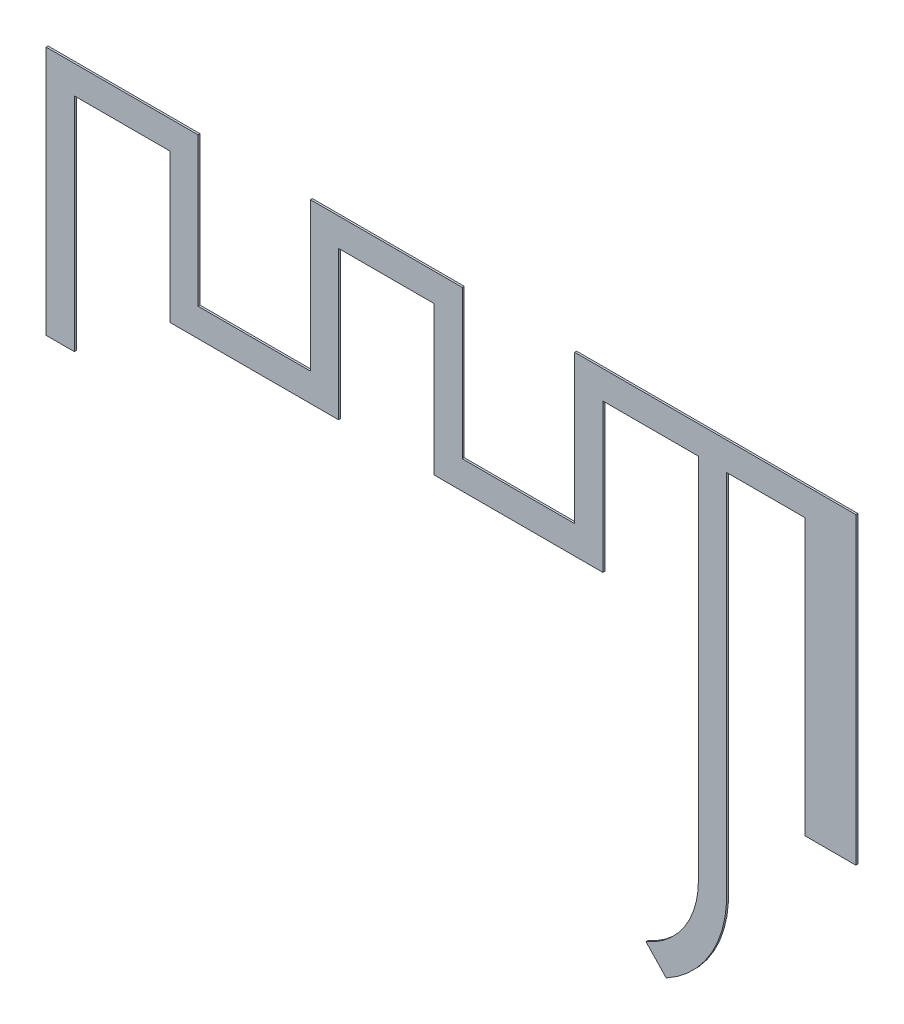
ISO-10303-21;
HEADER;
FILE_DESCRIPTION(('STEP AP214'),'2;1');
FILE_NAME('part.step','',(''),(''),'','','');
FILE_SCHEMA(('AUTOMOTIVE_DESIGN { 1 0 10303 214 1 1 1 1 }'));
ENDSEC;
DATA;
#1=APPLICATION_CONTEXT('core data for automotive mechanical design processes');
#2=APPLICATION_PROTOCOL_DEFINITION('international standard','automotive_design',2000,#1);
#3=PRODUCT_CONTEXT('',#1,'mechanical');
#4=PRODUCT('Part','Part','',(#3));
#5=PRODUCT_RELATED_PRODUCT_CATEGORY('part','',(#4));
#6=PRODUCT_DEFINITION_FORMATION('','',#4);
#7=PRODUCT_DEFINITION_CONTEXT('part definition',#1,'design');
#8=PRODUCT_DEFINITION('design','',#6,#7);
#9=PRODUCT_DEFINITION_SHAPE('','',#8);
#10=(LENGTH_UNIT() NAMED_UNIT(*) SI_UNIT(.MILLI.,.METRE.));
#11=(NAMED_UNIT(*) PLANE_ANGLE_UNIT() SI_UNIT($,.RADIAN.));
#12=(NAMED_UNIT(*) SI_UNIT($,.STERADIAN.) SOLID_ANGLE_UNIT());
#13=UNCERTAINTY_MEASURE_WITH_UNIT(LENGTH_MEASURE(1.E-05),#10,'distance_accuracy_value','');
#14=(GEOMETRIC_REPRESENTATION_CONTEXT(3) GLOBAL_UNCERTAINTY_ASSIGNED_CONTEXT((#13)) GLOBAL_UNIT_ASSIGNED_CONTEXT((#10,
#11,#12)) REPRESENTATION_CONTEXT('',''));
#15=CARTESIAN_POINT('',(0.,0.,0.));
#16=DIRECTION('',(0.,0.,1.));
#17=DIRECTION('',(1.,0.,0.));
#18=AXIS2_PLACEMENT_3D('',#15,#16,#17);
#19=CARTESIAN_POINT('',(177.15,-43.365,0.035));
#20=DIRECTION('',(-1.,0.,0.));
#21=DIRECTION('',(0.,0.,1.));
#22=AXIS2_PLACEMENT_3D('',#19,#20,#21);
#23=PLANE('',#22);
#24=DIRECTION('',(0.,1.,0.));
#25=VECTOR('',#24,1.);
#26=CARTESIAN_POINT('',(177.15,-43.365,0.));
#27=LINE('',#26,#25);
#28=CARTESIAN_POINT('',(177.15,-45.336779,0.));
#29=VERTEX_POINT('',#28);
#30=CARTESIAN_POINT('',(177.15,-38.715,0.));
#31=VERTEX_POINT('',#30);
#32=EDGE_CURVE('E157',#29,#31,#27,.T.);
#33=ORIENTED_EDGE('',*,*,#32,.T.);
#34=DIRECTION('',(0.,0.,-1.));
#35=VECTOR('',#34,1.);
#36=CARTESIAN_POINT('',(177.15,-38.715,0.035));
#37=LINE('',#36,#35);
#38=CARTESIAN_POINT('',(177.15,-38.715,0.035));
#39=VERTEX_POINT('',#38);
#40=EDGE_CURVE('E11',#39,#31,#37,.T.);
#41=ORIENTED_EDGE('',*,*,#40,.F.);
#42=DIRECTION('',(0.,1.,0.));
#43=VECTOR('',#42,1.);
#44=CARTESIAN_POINT('',(177.15,-43.365,0.035));
#45=LINE('',#44,#43);
#46=CARTESIAN_POINT('',(177.15,-45.336779,0.035));
#47=VERTEX_POINT('',#46);
#48=EDGE_CURVE('E163',#47,#39,#45,.T.);
#49=ORIENTED_EDGE('',*,*,#48,.F.);
#50=DIRECTION('',(0.,0.,-1.));
#51=VECTOR('',#50,1.);
#52=CARTESIAN_POINT('',(177.15,-45.336779,0.035));
#53=LINE('',#52,#51);
#54=EDGE_CURVE('E263',#47,#29,#53,.T.);
#55=ORIENTED_EDGE('',*,*,#54,.T.);
#56=EDGE_LOOP('',(#33,#41,#49,#55));
#57=FACE_BOUND('',#56,.T.);
#58=ADVANCED_FACE('F39',(#57),#23,.F.);
#59=CARTESIAN_POINT('',(177.15,-38.715,0.035));
#60=DIRECTION('',(0.,1.,0.));
#61=DIRECTION('',(0.,0.,1.));
#62=AXIS2_PLACEMENT_3D('',#59,#60,#61);
#63=PLANE('',#62);
#64=DIRECTION('',(1.,0.,0.));
#65=VECTOR('',#64,1.);
#66=CARTESIAN_POINT('',(177.15,-38.715,0.));
#67=LINE('',#66,#65);
#68=CARTESIAN_POINT('',(178.55,-38.715,0.));
#69=VERTEX_POINT('',#68);
#70=EDGE_CURVE('E268',#31,#69,#67,.T.);
#71=ORIENTED_EDGE('',*,*,#70,.T.);
#72=DIRECTION('',(0.,0.,-1.));
#73=VECTOR('',#72,1.);
#74=CARTESIAN_POINT('',(178.55,-38.715,0.035));
#75=LINE('',#74,#73);
#76=CARTESIAN_POINT('',(178.55,-38.715,0.035));
#77=VERTEX_POINT('',#76);
#78=EDGE_CURVE('E47',#77,#69,#75,.T.);
#79=ORIENTED_EDGE('',*,*,#78,.F.);
#80=DIRECTION('',(1.,0.,0.));
#81=VECTOR('',#80,1.);
#82=CARTESIAN_POINT('',(177.15,-38.715,0.035));
#83=LINE('',#82,#81);
#84=EDGE_CURVE('E482',#39,#77,#83,.T.);
#85=ORIENTED_EDGE('',*,*,#84,.F.);
#86=ORIENTED_EDGE('',*,*,#40,.T.);
#87=EDGE_LOOP('',(#71,#79,#85,#86));
#88=FACE_BOUND('',#87,.T.);
#89=ADVANCED_FACE('F485',(#88),#63,.F.);
#90=CARTESIAN_POINT('',(178.55,-38.715,0.035));
#91=DIRECTION('',(1.,0.,0.));
#92=DIRECTION('',(0.,0.,-1.));
#93=AXIS2_PLACEMENT_3D('',#90,#91,#92);
#94=PLANE('',#93);
#95=DIRECTION('',(0.,-1.,0.));
#96=VECTOR('',#95,1.);
#97=CARTESIAN_POINT('',(178.55,-38.715,0.));
#98=LINE('',#97,#96);
#99=CARTESIAN_POINT('',(178.55,-43.615,0.));
#100=VERTEX_POINT('',#99);
#101=EDGE_CURVE('E270',#69,#100,#98,.T.);
#102=ORIENTED_EDGE('',*,*,#101,.T.);
#103=DIRECTION('',(0.,0.,-1.));
#104=VECTOR('',#103,1.);
#105=CARTESIAN_POINT('',(178.55,-43.615,0.035));
#106=LINE('',#105,#104);
#107=CARTESIAN_POINT('',(178.55,-43.615,0.035));
#108=VERTEX_POINT('',#107);
#109=EDGE_CURVE('E398',#108,#100,#106,.T.);
#110=ORIENTED_EDGE('',*,*,#109,.F.);
#111=DIRECTION('',(0.,-1.,0.));
#112=VECTOR('',#111,1.);
#113=CARTESIAN_POINT('',(178.55,-38.715,0.035));
#114=LINE('',#113,#112);
#115=EDGE_CURVE('E407',#77,#108,#114,.T.);
#116=ORIENTED_EDGE('',*,*,#115,.F.);
#117=ORIENTED_EDGE('',*,*,#78,.T.);
#118=EDGE_LOOP('',(#102,#110,#116,#117));
#119=FACE_BOUND('',#118,.T.);
#120=ADVANCED_FACE('F405',(#119),#94,.F.);
#121=CARTESIAN_POINT('',(178.55,-43.615,0.035));
#122=DIRECTION('',(0.,1.,0.));
#123=DIRECTION('',(0.,0.,1.));
#124=AXIS2_PLACEMENT_3D('',#121,#122,#123);
#125=PLANE('',#124);
#126=DIRECTION('',(1.,0.,0.));
#127=VECTOR('',#126,1.);
#128=CARTESIAN_POINT('',(178.55,-43.615,0.));
#129=LINE('',#128,#127);
#130=CARTESIAN_POINT('',(179.45,-43.615,0.));
#131=VERTEX_POINT('',#130);
#132=EDGE_CURVE('E272',#100,#131,#129,.T.);
#133=ORIENTED_EDGE('',*,*,#132,.T.);
#134=DIRECTION('',(0.,0.,-1.));
#135=VECTOR('',#134,1.);
#136=CARTESIAN_POINT('',(179.45,-43.615,0.035));
#137=LINE('',#136,#135);
#138=CARTESIAN_POINT('',(179.45,-43.615,0.035));
#139=VERTEX_POINT('',#138);
#140=EDGE_CURVE('E395',#139,#131,#137,.T.);
#141=ORIENTED_EDGE('',*,*,#140,.F.);
#142=DIRECTION('',(1.,0.,0.));
#143=VECTOR('',#142,1.);
#144=CARTESIAN_POINT('',(178.55,-43.615,0.035));
#145=LINE('',#144,#143);
#146=EDGE_CURVE('E425',#108,#139,#145,.T.);
#147=ORIENTED_EDGE('',*,*,#146,.F.);
#148=ORIENTED_EDGE('',*,*,#109,.T.);
#149=EDGE_LOOP('',(#133,#141,#147,#148));
#150=FACE_BOUND('',#149,.T.);
#151=ADVANCED_FACE('F416',(#150),#125,.F.);
#152=CARTESIAN_POINT('',(179.45,-43.615,0.035));
#153=DIRECTION('',(-1.,0.,0.));
#154=DIRECTION('',(0.,0.,1.));
#155=AXIS2_PLACEMENT_3D('',#152,#153,#154);
#156=PLANE('',#155);
#157=DIRECTION('',(0.,1.,0.));
#158=VECTOR('',#157,1.);
#159=CARTESIAN_POINT('',(179.45,-43.615,0.));
#160=LINE('',#159,#158);
#161=CARTESIAN_POINT('',(179.45,-38.215,0.));
#162=VERTEX_POINT('',#161);
#163=EDGE_CURVE('E274',#131,#162,#160,.T.);
#164=ORIENTED_EDGE('',*,*,#163,.T.);
#165=DIRECTION('',(0.,0.,-1.));
#166=VECTOR('',#165,1.);
#167=CARTESIAN_POINT('',(179.45,-38.215,0.035));
#168=LINE('',#167,#166);
#169=CARTESIAN_POINT('',(179.45,-38.215,0.035));
#170=VERTEX_POINT('',#169);
#171=EDGE_CURVE('E392',#170,#162,#168,.T.);
#172=ORIENTED_EDGE('',*,*,#171,.F.);
#173=DIRECTION('',(0.,1.,0.));
#174=VECTOR('',#173,1.);
#175=CARTESIAN_POINT('',(179.45,-43.615,0.035));
#176=LINE('',#175,#174);
#177=EDGE_CURVE('E422',#139,#170,#176,.T.);
#178=ORIENTED_EDGE('',*,*,#177,.F.);
#179=ORIENTED_EDGE('',*,*,#140,.T.);
#180=EDGE_LOOP('',(#164,#172,#178,#179));
#181=FACE_BOUND('',#180,.T.);
#182=ADVANCED_FACE('F420',(#181),#156,.F.);
#183=CARTESIAN_POINT('',(179.45,-38.215,0.035));
#184=DIRECTION('',(0.,-1.,0.));
#185=DIRECTION('',(0.,0.,-1.));
#186=AXIS2_PLACEMENT_3D('',#183,#184,#185);
#187=PLANE('',#186);
#188=DIRECTION('',(-1.,0.,0.));
#189=VECTOR('',#188,1.);
#190=CARTESIAN_POINT('',(179.45,-38.215,0.));
#191=LINE('',#190,#189);
#192=CARTESIAN_POINT('',(174.45,-38.215,0.));
#193=VERTEX_POINT('',#192);
#194=EDGE_CURVE('E276',#162,#193,#191,.T.);
#195=ORIENTED_EDGE('',*,*,#194,.T.);
#196=DIRECTION('',(0.,0.,-1.));
#197=VECTOR('',#196,1.);
#198=CARTESIAN_POINT('',(174.45,-38.215,0.035));
#199=LINE('',#198,#197);
#200=CARTESIAN_POINT('',(174.45,-38.215,0.035));
#201=VERTEX_POINT('',#200);
#202=EDGE_CURVE('E389',#201,#193,#199,.T.);
#203=ORIENTED_EDGE('',*,*,#202,.F.);
#204=DIRECTION('',(-1.,0.,0.));
#205=VECTOR('',#204,1.);
#206=CARTESIAN_POINT('',(179.45,-38.215,0.035));
#207=LINE('',#206,#205);
#208=EDGE_CURVE('E424',#170,#201,#207,.T.);
#209=ORIENTED_EDGE('',*,*,#208,.F.);
#210=ORIENTED_EDGE('',*,*,#171,.T.);
#211=EDGE_LOOP('',(#195,#203,#209,#210));
#212=FACE_BOUND('',#211,.T.);
#213=ADVANCED_FACE('F497',(#212),#187,.F.);
#214=CARTESIAN_POINT('',(174.45,-38.215,0.035));
#215=DIRECTION('',(1.,0.,0.));
#216=DIRECTION('',(0.,0.,-1.));
#217=AXIS2_PLACEMENT_3D('',#214,#215,#216);
#218=PLANE('',#217);
#219=DIRECTION('',(0.,-1.,0.));
#220=VECTOR('',#219,1.);
#221=CARTESIAN_POINT('',(174.45,-38.215,0.));
#222=LINE('',#221,#220);
#223=CARTESIAN_POINT('',(174.45,-40.855,0.));
#224=VERTEX_POINT('',#223);
#225=EDGE_CURVE('E278',#193,#224,#222,.T.);
#226=ORIENTED_EDGE('',*,*,#225,.T.);
#227=DIRECTION('',(0.,0.,-1.));
#228=VECTOR('',#227,1.);
#229=CARTESIAN_POINT('',(174.45,-40.855,0.035));
#230=LINE('',#229,#228);
#231=CARTESIAN_POINT('',(174.45,-40.855,0.035));
#232=VERTEX_POINT('',#231);
#233=EDGE_CURVE('E386',#232,#224,#230,.T.);
#234=ORIENTED_EDGE('',*,*,#233,.F.);
#235=DIRECTION('',(0.,-1.,0.));
#236=VECTOR('',#235,1.);
#237=CARTESIAN_POINT('',(174.45,-38.215,0.035));
#238=LINE('',#237,#236);
#239=EDGE_CURVE('E427',#201,#232,#238,.T.);
#240=ORIENTED_EDGE('',*,*,#239,.F.);
#241=ORIENTED_EDGE('',*,*,#202,.T.);
#242=EDGE_LOOP('',(#226,#234,#240,#241));
#243=FACE_BOUND('',#242,.T.);
#244=ADVANCED_FACE('F500',(#243),#218,.F.);
#245=CARTESIAN_POINT('',(174.45,-40.855,0.035));
#246=DIRECTION('',(0.,-1.,0.));
#247=DIRECTION('',(0.,0.,-1.));
#248=AXIS2_PLACEMENT_3D('',#245,#246,#247);
#249=PLANE('',#248);
#250=DIRECTION('',(-1.,0.,0.));
#251=VECTOR('',#250,1.);
#252=CARTESIAN_POINT('',(174.45,-40.855,0.));
#253=LINE('',#252,#251);
#254=CARTESIAN_POINT('',(172.45,-40.855,0.));
#255=VERTEX_POINT('',#254);
#256=EDGE_CURVE('E280',#224,#255,#253,.T.);
#257=ORIENTED_EDGE('',*,*,#256,.T.);
#258=DIRECTION('',(0.,0.,-1.));
#259=VECTOR('',#258,1.);
#260=CARTESIAN_POINT('',(172.45,-40.855,0.035));
#261=LINE('',#260,#259);
#262=CARTESIAN_POINT('',(172.45,-40.855,0.035));
#263=VERTEX_POINT('',#262);
#264=EDGE_CURVE('E383',#263,#255,#261,.T.);
#265=ORIENTED_EDGE('',*,*,#264,.F.);
#266=DIRECTION('',(-1.,0.,0.));
#267=VECTOR('',#266,1.);
#268=CARTESIAN_POINT('',(174.45,-40.855,0.035));
#269=LINE('',#268,#267);
#270=EDGE_CURVE('E433',#232,#263,#269,.T.);
#271=ORIENTED_EDGE('',*,*,#270,.F.);
#272=ORIENTED_EDGE('',*,*,#233,.T.);
#273=EDGE_LOOP('',(#257,#265,#271,#272));
#274=FACE_BOUND('',#273,.T.);
#275=ADVANCED_FACE('F504',(#274),#249,.F.);
#276=CARTESIAN_POINT('',(172.45,-40.855,0.035));
#277=DIRECTION('',(-1.,0.,0.));
#278=DIRECTION('',(0.,0.,1.));
#279=AXIS2_PLACEMENT_3D('',#276,#277,#278);
#280=PLANE('',#279);
#281=DIRECTION('',(0.,1.,0.));
#282=VECTOR('',#281,1.);
#283=CARTESIAN_POINT('',(172.45,-40.855,0.));
#284=LINE('',#283,#282);
#285=CARTESIAN_POINT('',(172.45,-38.215,0.));
#286=VERTEX_POINT('',#285);
#287=EDGE_CURVE('E282',#255,#286,#284,.T.);
#288=ORIENTED_EDGE('',*,*,#287,.T.);
#289=DIRECTION('',(0.,0.,-1.));
#290=VECTOR('',#289,1.);
#291=CARTESIAN_POINT('',(172.45,-38.215,0.035));
#292=LINE('',#291,#290);
#293=CARTESIAN_POINT('',(172.45,-38.215,0.035));
#294=VERTEX_POINT('',#293);
#295=EDGE_CURVE('E380',#294,#286,#292,.T.);
#296=ORIENTED_EDGE('',*,*,#295,.F.);
#297=DIRECTION('',(0.,1.,0.));
#298=VECTOR('',#297,1.);
#299=CARTESIAN_POINT('',(172.45,-40.855,0.035));
#300=LINE('',#299,#298);
#301=EDGE_CURVE('E435',#263,#294,#300,.T.);
#302=ORIENTED_EDGE('',*,*,#301,.F.);
#303=ORIENTED_EDGE('',*,*,#264,.T.);
#304=EDGE_LOOP('',(#288,#296,#302,#303));
#305=FACE_BOUND('',#304,.T.);
#306=ADVANCED_FACE('F508',(#305),#280,.F.);
#307=CARTESIAN_POINT('',(172.45,-38.215,0.035));
#308=DIRECTION('',(0.,-1.,0.));
#309=DIRECTION('',(0.,0.,-1.));
#310=AXIS2_PLACEMENT_3D('',#307,#308,#309);
#311=PLANE('',#310);
#312=DIRECTION('',(-1.,0.,0.));
#313=VECTOR('',#312,1.);
#314=CARTESIAN_POINT('',(172.45,-38.215,0.));
#315=LINE('',#314,#313);
#316=CARTESIAN_POINT('',(169.75,-38.215,0.));
#317=VERTEX_POINT('',#316);
#318=EDGE_CURVE('E284',#286,#317,#315,.T.);
#319=ORIENTED_EDGE('',*,*,#318,.T.);
#320=DIRECTION('',(0.,0.,-1.));
#321=VECTOR('',#320,1.);
#322=CARTESIAN_POINT('',(169.75,-38.215,0.035));
#323=LINE('',#322,#321);
#324=CARTESIAN_POINT('',(169.75,-38.215,0.035));
#325=VERTEX_POINT('',#324);
#326=EDGE_CURVE('E377',#325,#317,#323,.T.);
#327=ORIENTED_EDGE('',*,*,#326,.F.);
#328=DIRECTION('',(-1.,0.,0.));
#329=VECTOR('',#328,1.);
#330=CARTESIAN_POINT('',(172.45,-38.215,0.035));
#331=LINE('',#330,#329);
#332=EDGE_CURVE('E437',#294,#325,#331,.T.);
#333=ORIENTED_EDGE('',*,*,#332,.F.);
#334=ORIENTED_EDGE('',*,*,#295,.T.);
#335=EDGE_LOOP('',(#319,#327,#333,#334));
#336=FACE_BOUND('',#335,.T.);
#337=ADVANCED_FACE('F512',(#336),#311,.F.);
#338=CARTESIAN_POINT('',(169.75,-38.215,0.035));
#339=DIRECTION('',(1.,0.,0.));
#340=DIRECTION('',(0.,0.,-1.));
#341=AXIS2_PLACEMENT_3D('',#338,#339,#340);
#342=PLANE('',#341);
#343=DIRECTION('',(0.,-1.,0.));
#344=VECTOR('',#343,1.);
#345=CARTESIAN_POINT('',(169.75,-38.215,0.));
#346=LINE('',#345,#344);
#347=CARTESIAN_POINT('',(169.75,-40.855,0.));
#348=VERTEX_POINT('',#347);
#349=EDGE_CURVE('E286',#317,#348,#346,.T.);
#350=ORIENTED_EDGE('',*,*,#349,.T.);
#351=DIRECTION('',(0.,0.,-1.));
#352=VECTOR('',#351,1.);
#353=CARTESIAN_POINT('',(169.75,-40.855,0.035));
#354=LINE('',#353,#352);
#355=CARTESIAN_POINT('',(169.75,-40.855,0.035));
#356=VERTEX_POINT('',#355);
#357=EDGE_CURVE('E374',#356,#348,#354,.T.);
#358=ORIENTED_EDGE('',*,*,#357,.F.);
#359=DIRECTION('',(0.,-1.,0.));
#360=VECTOR('',#359,1.);
#361=CARTESIAN_POINT('',(169.75,-38.215,0.035));
#362=LINE('',#361,#360);
#363=EDGE_CURVE('E439',#325,#356,#362,.T.);
#364=ORIENTED_EDGE('',*,*,#363,.F.);
#365=ORIENTED_EDGE('',*,*,#326,.T.);
#366=EDGE_LOOP('',(#350,#358,#364,#365));
#367=FACE_BOUND('',#366,.T.);
#368=ADVANCED_FACE('F516',(#367),#342,.F.);
#369=CARTESIAN_POINT('',(169.75,-40.855,0.035));
#370=DIRECTION('',(0.,-1.,0.));
#371=DIRECTION('',(0.,0.,-1.));
#372=AXIS2_PLACEMENT_3D('',#369,#370,#371);
#373=PLANE('',#372);
#374=DIRECTION('',(-1.,0.,0.));
#375=VECTOR('',#374,1.);
#376=CARTESIAN_POINT('',(169.75,-40.855,0.));
#377=LINE('',#376,#375);
#378=CARTESIAN_POINT('',(167.75,-40.855,0.));
#379=VERTEX_POINT('',#378);
#380=EDGE_CURVE('E288',#348,#379,#377,.T.);
#381=ORIENTED_EDGE('',*,*,#380,.T.);
#382=DIRECTION('',(0.,0.,-1.));
#383=VECTOR('',#382,1.);
#384=CARTESIAN_POINT('',(167.75,-40.855,0.035));
#385=LINE('',#384,#383);
#386=CARTESIAN_POINT('',(167.75,-40.855,0.035));
#387=VERTEX_POINT('',#386);
#388=EDGE_CURVE('E371',#387,#379,#385,.T.);
#389=ORIENTED_EDGE('',*,*,#388,.F.);
#390=DIRECTION('',(-1.,0.,0.));
#391=VECTOR('',#390,1.);
#392=CARTESIAN_POINT('',(169.75,-40.855,0.035));
#393=LINE('',#392,#391);
#394=EDGE_CURVE('E441',#356,#387,#393,.T.);
#395=ORIENTED_EDGE('',*,*,#394,.F.);
#396=ORIENTED_EDGE('',*,*,#357,.T.);
#397=EDGE_LOOP('',(#381,#389,#395,#396));
#398=FACE_BOUND('',#397,.T.);
#399=ADVANCED_FACE('F520',(#398),#373,.F.);
#400=CARTESIAN_POINT('',(167.75,-40.855,0.035));
#401=DIRECTION('',(-1.,0.,0.));
#402=DIRECTION('',(0.,0.,1.));
#403=AXIS2_PLACEMENT_3D('',#400,#401,#402);
#404=PLANE('',#403);
#405=DIRECTION('',(0.,1.,0.));
#406=VECTOR('',#405,1.);
#407=CARTESIAN_POINT('',(167.75,-40.855,0.));
#408=LINE('',#407,#406);
#409=CARTESIAN_POINT('',(167.75,-38.215,0.));
#410=VERTEX_POINT('',#409);
#411=EDGE_CURVE('E290',#379,#410,#408,.T.);
#412=ORIENTED_EDGE('',*,*,#411,.T.);
#413=DIRECTION('',(0.,0.,-1.));
#414=VECTOR('',#413,1.);
#415=CARTESIAN_POINT('',(167.75,-38.215,0.035));
#416=LINE('',#415,#414);
#417=CARTESIAN_POINT('',(167.75,-38.215,0.035));
#418=VERTEX_POINT('',#417);
#419=EDGE_CURVE('E368',#418,#410,#416,.T.);
#420=ORIENTED_EDGE('',*,*,#419,.F.);
#421=DIRECTION('',(0.,1.,0.));
#422=VECTOR('',#421,1.);
#423=CARTESIAN_POINT('',(167.75,-40.855,0.035));
#424=LINE('',#423,#422);
#425=EDGE_CURVE('E443',#387,#418,#424,.T.);
#426=ORIENTED_EDGE('',*,*,#425,.F.);
#427=ORIENTED_EDGE('',*,*,#388,.T.);
#428=EDGE_LOOP('',(#412,#420,#426,#427));
#429=FACE_BOUND('',#428,.T.);
#430=ADVANCED_FACE('F524',(#429),#404,.F.);
#431=CARTESIAN_POINT('',(167.75,-38.215,0.035));
#432=DIRECTION('',(0.,-1.,0.));
#433=DIRECTION('',(0.,0.,-1.));
#434=AXIS2_PLACEMENT_3D('',#431,#432,#433);
#435=PLANE('',#434);
#436=DIRECTION('',(-1.,0.,0.));
#437=VECTOR('',#436,1.);
#438=CARTESIAN_POINT('',(167.75,-38.215,0.));
#439=LINE('',#438,#437);
#440=CARTESIAN_POINT('',(165.05,-38.215,0.));
#441=VERTEX_POINT('',#440);
#442=EDGE_CURVE('E292',#410,#441,#439,.T.);
#443=ORIENTED_EDGE('',*,*,#442,.T.);
#444=DIRECTION('',(0.,0.,-1.));
#445=VECTOR('',#444,1.);
#446=CARTESIAN_POINT('',(165.05,-38.215,0.035));
#447=LINE('',#446,#445);
#448=CARTESIAN_POINT('',(165.05,-38.215,0.035));
#449=VERTEX_POINT('',#448);
#450=EDGE_CURVE('E365',#449,#441,#447,.T.);
#451=ORIENTED_EDGE('',*,*,#450,.F.);
#452=DIRECTION('',(-1.,0.,0.));
#453=VECTOR('',#452,1.);
#454=CARTESIAN_POINT('',(167.75,-38.215,0.035));
#455=LINE('',#454,#453);
#456=EDGE_CURVE('E445',#418,#449,#455,.T.);
#457=ORIENTED_EDGE('',*,*,#456,.F.);
#458=ORIENTED_EDGE('',*,*,#419,.T.);
#459=EDGE_LOOP('',(#443,#451,#457,#458));
#460=FACE_BOUND('',#459,.T.);
#461=ADVANCED_FACE('F528',(#460),#435,.F.);
#462=CARTESIAN_POINT('',(165.05,-38.215,0.035));
#463=DIRECTION('',(1.,0.,0.));
#464=DIRECTION('',(0.,0.,-1.));
#465=AXIS2_PLACEMENT_3D('',#462,#463,#464);
#466=PLANE('',#465);
#467=DIRECTION('',(0.,-1.,0.));
#468=VECTOR('',#467,1.);
#469=CARTESIAN_POINT('',(165.05,-38.215,0.));
#470=LINE('',#469,#468);
#471=CARTESIAN_POINT('',(165.05,-42.655,0.));
#472=VERTEX_POINT('',#471);
#473=EDGE_CURVE('E294',#441,#472,#470,.T.);
#474=ORIENTED_EDGE('',*,*,#473,.T.);
#475=DIRECTION('',(0.,0.,-1.));
#476=VECTOR('',#475,1.);
#477=CARTESIAN_POINT('',(165.05,-42.655,0.035));
#478=LINE('',#477,#476);
#479=CARTESIAN_POINT('',(165.05,-42.655,0.035));
#480=VERTEX_POINT('',#479);
#481=EDGE_CURVE('E362',#480,#472,#478,.T.);
#482=ORIENTED_EDGE('',*,*,#481,.F.);
#483=DIRECTION('',(0.,-1.,0.));
#484=VECTOR('',#483,1.);
#485=CARTESIAN_POINT('',(165.05,-38.215,0.035));
#486=LINE('',#485,#484);
#487=EDGE_CURVE('E447',#449,#480,#486,.T.);
#488=ORIENTED_EDGE('',*,*,#487,.F.);
#489=ORIENTED_EDGE('',*,*,#450,.T.);
#490=EDGE_LOOP('',(#474,#482,#488,#489));
#491=FACE_BOUND('',#490,.T.);
#492=ADVANCED_FACE('F532',(#491),#466,.F.);
#493=CARTESIAN_POINT('',(165.05,-42.655,0.035));
#494=DIRECTION('',(0.,1.,0.));
#495=DIRECTION('',(0.,0.,1.));
#496=AXIS2_PLACEMENT_3D('',#493,#494,#495);
#497=PLANE('',#496);
#498=DIRECTION('',(1.,0.,0.));
#499=VECTOR('',#498,1.);
#500=CARTESIAN_POINT('',(165.05,-42.655,0.));
#501=LINE('',#500,#499);
#502=CARTESIAN_POINT('',(165.55,-42.655,0.));
#503=VERTEX_POINT('',#502);
#504=EDGE_CURVE('E296',#472,#503,#501,.T.);
#505=ORIENTED_EDGE('',*,*,#504,.T.);
#506=DIRECTION('',(0.,0.,-1.));
#507=VECTOR('',#506,1.);
#508=CARTESIAN_POINT('',(165.55,-42.655,0.035));
#509=LINE('',#508,#507);
#510=CARTESIAN_POINT('',(165.55,-42.655,0.035));
#511=VERTEX_POINT('',#510);
#512=EDGE_CURVE('E359',#511,#503,#509,.T.);
#513=ORIENTED_EDGE('',*,*,#512,.F.);
#514=DIRECTION('',(1.,0.,0.));
#515=VECTOR('',#514,1.);
#516=CARTESIAN_POINT('',(165.05,-42.655,0.035));
#517=LINE('',#516,#515);
#518=EDGE_CURVE('E449',#480,#511,#517,.T.);
#519=ORIENTED_EDGE('',*,*,#518,.F.);
#520=ORIENTED_EDGE('',*,*,#481,.T.);
#521=EDGE_LOOP('',(#505,#513,#519,#520));
#522=FACE_BOUND('',#521,.T.);
#523=ADVANCED_FACE('F536',(#522),#497,.F.);
#524=CARTESIAN_POINT('',(165.55,-42.655,0.035));
#525=DIRECTION('',(-1.,0.,0.));
#526=DIRECTION('',(0.,0.,1.));
#527=AXIS2_PLACEMENT_3D('',#524,#525,#526);
#528=PLANE('',#527);
#529=DIRECTION('',(0.,1.,0.));
#530=VECTOR('',#529,1.);
#531=CARTESIAN_POINT('',(165.55,-42.655,0.));
#532=LINE('',#531,#530);
#533=CARTESIAN_POINT('',(165.55,-38.715,0.));
#534=VERTEX_POINT('',#533);
#535=EDGE_CURVE('E298',#503,#534,#532,.T.);
#536=ORIENTED_EDGE('',*,*,#535,.T.);
#537=DIRECTION('',(0.,0.,-1.));
#538=VECTOR('',#537,1.);
#539=CARTESIAN_POINT('',(165.55,-38.715,0.035));
#540=LINE('',#539,#538);
#541=CARTESIAN_POINT('',(165.55,-38.715,0.035));
#542=VERTEX_POINT('',#541);
#543=EDGE_CURVE('E356',#542,#534,#540,.T.);
#544=ORIENTED_EDGE('',*,*,#543,.F.);
#545=DIRECTION('',(0.,1.,0.));
#546=VECTOR('',#545,1.);
#547=CARTESIAN_POINT('',(165.55,-42.655,0.035));
#548=LINE('',#547,#546);
#549=EDGE_CURVE('E451',#511,#542,#548,.T.);
#550=ORIENTED_EDGE('',*,*,#549,.F.);
#551=ORIENTED_EDGE('',*,*,#512,.T.);
#552=EDGE_LOOP('',(#536,#544,#550,#551));
#553=FACE_BOUND('',#552,.T.);
#554=ADVANCED_FACE('F540',(#553),#528,.F.);
#555=CARTESIAN_POINT('',(165.55,-38.715,0.035));
#556=DIRECTION('',(0.,1.,0.));
#557=DIRECTION('',(0.,0.,1.));
#558=AXIS2_PLACEMENT_3D('',#555,#556,#557);
#559=PLANE('',#558);
#560=DIRECTION('',(1.,0.,0.));
#561=VECTOR('',#560,1.);
#562=CARTESIAN_POINT('',(165.55,-38.715,0.));
#563=LINE('',#562,#561);
#564=CARTESIAN_POINT('',(167.25,-38.715,0.));
#565=VERTEX_POINT('',#564);
#566=EDGE_CURVE('E300',#534,#565,#563,.T.);
#567=ORIENTED_EDGE('',*,*,#566,.T.);
#568=DIRECTION('',(0.,0.,-1.));
#569=VECTOR('',#568,1.);
#570=CARTESIAN_POINT('',(167.25,-38.715,0.035));
#571=LINE('',#570,#569);
#572=CARTESIAN_POINT('',(167.25,-38.715,0.035));
#573=VERTEX_POINT('',#572);
#574=EDGE_CURVE('E353',#573,#565,#571,.T.);
#575=ORIENTED_EDGE('',*,*,#574,.F.);
#576=DIRECTION('',(1.,0.,0.));
#577=VECTOR('',#576,1.);
#578=CARTESIAN_POINT('',(165.55,-38.715,0.035));
#579=LINE('',#578,#577);
#580=EDGE_CURVE('E453',#542,#573,#579,.T.);
#581=ORIENTED_EDGE('',*,*,#580,.F.);
#582=ORIENTED_EDGE('',*,*,#543,.T.);
#583=EDGE_LOOP('',(#567,#575,#581,#582));
#584=FACE_BOUND('',#583,.T.);
#585=ADVANCED_FACE('F544',(#584),#559,.F.);
#586=CARTESIAN_POINT('',(167.25,-38.715,0.035));
#587=DIRECTION('',(1.,0.,0.));
#588=DIRECTION('',(0.,0.,-1.));
#589=AXIS2_PLACEMENT_3D('',#586,#587,#588);
#590=PLANE('',#589);
#591=DIRECTION('',(0.,-1.,0.));
#592=VECTOR('',#591,1.);
#593=CARTESIAN_POINT('',(167.25,-38.715,0.));
#594=LINE('',#593,#592);
#595=CARTESIAN_POINT('',(167.25,-41.355,0.));
#596=VERTEX_POINT('',#595);
#597=EDGE_CURVE('E302',#565,#596,#594,.T.);
#598=ORIENTED_EDGE('',*,*,#597,.T.);
#599=DIRECTION('',(0.,0.,-1.));
#600=VECTOR('',#599,1.);
#601=CARTESIAN_POINT('',(167.25,-41.355,0.035));
#602=LINE('',#601,#600);
#603=CARTESIAN_POINT('',(167.25,-41.355,0.035));
#604=VERTEX_POINT('',#603);
#605=EDGE_CURVE('E350',#604,#596,#602,.T.);
#606=ORIENTED_EDGE('',*,*,#605,.F.);
#607=DIRECTION('',(0.,-1.,0.));
#608=VECTOR('',#607,1.);
#609=CARTESIAN_POINT('',(167.25,-38.715,0.035));
#610=LINE('',#609,#608);
#611=EDGE_CURVE('E455',#573,#604,#610,.T.);
#612=ORIENTED_EDGE('',*,*,#611,.F.);
#613=ORIENTED_EDGE('',*,*,#574,.T.);
#614=EDGE_LOOP('',(#598,#606,#612,#613));
#615=FACE_BOUND('',#614,.T.);
#616=ADVANCED_FACE('F548',(#615),#590,.F.);
#617=CARTESIAN_POINT('',(167.25,-41.355,0.035));
#618=DIRECTION('',(0.,1.,0.));
#619=DIRECTION('',(0.,0.,1.));
#620=AXIS2_PLACEMENT_3D('',#617,#618,#619);
#621=PLANE('',#620);
#622=DIRECTION('',(1.,0.,0.));
#623=VECTOR('',#622,1.);
#624=CARTESIAN_POINT('',(167.25,-41.355,0.));
#625=LINE('',#624,#623);
#626=CARTESIAN_POINT('',(170.25,-41.355,0.));
#627=VERTEX_POINT('',#626);
#628=EDGE_CURVE('E304',#596,#627,#625,.T.);
#629=ORIENTED_EDGE('',*,*,#628,.T.);
#630=DIRECTION('',(0.,0.,-1.));
#631=VECTOR('',#630,1.);
#632=CARTESIAN_POINT('',(170.25,-41.355,0.035));
#633=LINE('',#632,#631);
#634=CARTESIAN_POINT('',(170.25,-41.355,0.035));
#635=VERTEX_POINT('',#634);
#636=EDGE_CURVE('E347',#635,#627,#633,.T.);
#637=ORIENTED_EDGE('',*,*,#636,.F.);
#638=DIRECTION('',(1.,0.,0.));
#639=VECTOR('',#638,1.);
#640=CARTESIAN_POINT('',(167.25,-41.355,0.035));
#641=LINE('',#640,#639);
#642=EDGE_CURVE('E457',#604,#635,#641,.T.);
#643=ORIENTED_EDGE('',*,*,#642,.F.);
#644=ORIENTED_EDGE('',*,*,#605,.T.);
#645=EDGE_LOOP('',(#629,#637,#643,#644));
#646=FACE_BOUND('',#645,.T.);
#647=ADVANCED_FACE('F552',(#646),#621,.F.);
#648=CARTESIAN_POINT('',(170.25,-41.355,0.035));
#649=DIRECTION('',(-1.,0.,0.));
#650=DIRECTION('',(0.,0.,1.));
#651=AXIS2_PLACEMENT_3D('',#648,#649,#650);
#652=PLANE('',#651);
#653=DIRECTION('',(0.,1.,0.));
#654=VECTOR('',#653,1.);
#655=CARTESIAN_POINT('',(170.25,-41.355,0.));
#656=LINE('',#655,#654);
#657=CARTESIAN_POINT('',(170.25,-38.715,0.));
#658=VERTEX_POINT('',#657);
#659=EDGE_CURVE('E306',#627,#658,#656,.T.);
#660=ORIENTED_EDGE('',*,*,#659,.T.);
#661=DIRECTION('',(0.,0.,-1.));
#662=VECTOR('',#661,1.);
#663=CARTESIAN_POINT('',(170.25,-38.715,0.035));
#664=LINE('',#663,#662);
#665=CARTESIAN_POINT('',(170.25,-38.715,0.035));
#666=VERTEX_POINT('',#665);
#667=EDGE_CURVE('E344',#666,#658,#664,.T.);
#668=ORIENTED_EDGE('',*,*,#667,.F.);
#669=DIRECTION('',(0.,1.,0.));
#670=VECTOR('',#669,1.);
#671=CARTESIAN_POINT('',(170.25,-41.355,0.035));
#672=LINE('',#671,#670);
#673=EDGE_CURVE('E459',#635,#666,#672,.T.);
#674=ORIENTED_EDGE('',*,*,#673,.F.);
#675=ORIENTED_EDGE('',*,*,#636,.T.);
#676=EDGE_LOOP('',(#660,#668,#674,#675));
#677=FACE_BOUND('',#676,.T.);
#678=ADVANCED_FACE('F556',(#677),#652,.F.);
#679=CARTESIAN_POINT('',(170.25,-38.715,0.035));
#680=DIRECTION('',(0.,1.,0.));
#681=DIRECTION('',(0.,0.,1.));
#682=AXIS2_PLACEMENT_3D('',#679,#680,#681);
#683=PLANE('',#682);
#684=DIRECTION('',(1.,0.,0.));
#685=VECTOR('',#684,1.);
#686=CARTESIAN_POINT('',(170.25,-38.715,0.));
#687=LINE('',#686,#685);
#688=CARTESIAN_POINT('',(171.95,-38.715,0.));
#689=VERTEX_POINT('',#688);
#690=EDGE_CURVE('E308',#658,#689,#687,.T.);
#691=ORIENTED_EDGE('',*,*,#690,.T.);
#692=DIRECTION('',(0.,0.,-1.));
#693=VECTOR('',#692,1.);
#694=CARTESIAN_POINT('',(171.95,-38.715,0.035));
#695=LINE('',#694,#693);
#696=CARTESIAN_POINT('',(171.95,-38.715,0.035));
#697=VERTEX_POINT('',#696);
#698=EDGE_CURVE('E341',#697,#689,#695,.T.);
#699=ORIENTED_EDGE('',*,*,#698,.F.);
#700=DIRECTION('',(1.,0.,0.));
#701=VECTOR('',#700,1.);
#702=CARTESIAN_POINT('',(170.25,-38.715,0.035));
#703=LINE('',#702,#701);
#704=EDGE_CURVE('E461',#666,#697,#703,.T.);
#705=ORIENTED_EDGE('',*,*,#704,.F.);
#706=ORIENTED_EDGE('',*,*,#667,.T.);
#707=EDGE_LOOP('',(#691,#699,#705,#706));
#708=FACE_BOUND('',#707,.T.);
#709=ADVANCED_FACE('F560',(#708),#683,.F.);
#710=CARTESIAN_POINT('',(171.95,-38.715,0.035));
#711=DIRECTION('',(1.,0.,0.));
#712=DIRECTION('',(0.,0.,-1.));
#713=AXIS2_PLACEMENT_3D('',#710,#711,#712);
#714=PLANE('',#713);
#715=DIRECTION('',(0.,-1.,0.));
#716=VECTOR('',#715,1.);
#717=CARTESIAN_POINT('',(171.95,-38.715,0.));
#718=LINE('',#717,#716);
#719=CARTESIAN_POINT('',(171.95,-41.355,0.));
#720=VERTEX_POINT('',#719);
#721=EDGE_CURVE('E310',#689,#720,#718,.T.);
#722=ORIENTED_EDGE('',*,*,#721,.T.);
#723=DIRECTION('',(0.,0.,-1.));
#724=VECTOR('',#723,1.);
#725=CARTESIAN_POINT('',(171.95,-41.355,0.035));
#726=LINE('',#725,#724);
#727=CARTESIAN_POINT('',(171.95,-41.355,0.035));
#728=VERTEX_POINT('',#727);
#729=EDGE_CURVE('E338',#728,#720,#726,.T.);
#730=ORIENTED_EDGE('',*,*,#729,.F.);
#731=DIRECTION('',(0.,-1.,0.));
#732=VECTOR('',#731,1.);
#733=CARTESIAN_POINT('',(171.95,-38.715,0.035));
#734=LINE('',#733,#732);
#735=EDGE_CURVE('E463',#697,#728,#734,.T.);
#736=ORIENTED_EDGE('',*,*,#735,.F.);
#737=ORIENTED_EDGE('',*,*,#698,.T.);
#738=EDGE_LOOP('',(#722,#730,#736,#737));
#739=FACE_BOUND('',#738,.T.);
#740=ADVANCED_FACE('F564',(#739),#714,.F.);
#741=CARTESIAN_POINT('',(171.95,-41.355,0.035));
#742=DIRECTION('',(0.,1.,0.));
#743=DIRECTION('',(0.,0.,1.));
#744=AXIS2_PLACEMENT_3D('',#741,#742,#743);
#745=PLANE('',#744);
#746=DIRECTION('',(1.,0.,0.));
#747=VECTOR('',#746,1.);
#748=CARTESIAN_POINT('',(171.95,-41.355,0.));
#749=LINE('',#748,#747);
#750=CARTESIAN_POINT('',(174.95,-41.355,0.));
#751=VERTEX_POINT('',#750);
#752=EDGE_CURVE('E312',#720,#751,#749,.T.);
#753=ORIENTED_EDGE('',*,*,#752,.T.);
#754=DIRECTION('',(0.,0.,-1.));
#755=VECTOR('',#754,1.);
#756=CARTESIAN_POINT('',(174.95,-41.355,0.035));
#757=LINE('',#756,#755);
#758=CARTESIAN_POINT('',(174.95,-41.355,0.035));
#759=VERTEX_POINT('',#758);
#760=EDGE_CURVE('E335',#759,#751,#757,.T.);
#761=ORIENTED_EDGE('',*,*,#760,.F.);
#762=DIRECTION('',(1.,0.,0.));
#763=VECTOR('',#762,1.);
#764=CARTESIAN_POINT('',(171.95,-41.355,0.035));
#765=LINE('',#764,#763);
#766=EDGE_CURVE('E465',#728,#759,#765,.T.);
#767=ORIENTED_EDGE('',*,*,#766,.F.);
#768=ORIENTED_EDGE('',*,*,#729,.T.);
#769=EDGE_LOOP('',(#753,#761,#767,#768));
#770=FACE_BOUND('',#769,.T.);
#771=ADVANCED_FACE('F568',(#770),#745,.F.);
#772=CARTESIAN_POINT('',(174.95,-41.355,0.035));
#773=DIRECTION('',(-1.,0.,0.));
#774=DIRECTION('',(0.,0.,1.));
#775=AXIS2_PLACEMENT_3D('',#772,#773,#774);
#776=PLANE('',#775);
#777=DIRECTION('',(0.,1.,0.));
#778=VECTOR('',#777,1.);
#779=CARTESIAN_POINT('',(174.95,-41.355,0.));
#780=LINE('',#779,#778);
#781=CARTESIAN_POINT('',(174.95,-38.715,0.));
#782=VERTEX_POINT('',#781);
#783=EDGE_CURVE('E314',#751,#782,#780,.T.);
#784=ORIENTED_EDGE('',*,*,#783,.T.);
#785=DIRECTION('',(0.,0.,-1.));
#786=VECTOR('',#785,1.);
#787=CARTESIAN_POINT('',(174.95,-38.715,0.035));
#788=LINE('',#787,#786);
#789=CARTESIAN_POINT('',(174.95,-38.715,0.035));
#790=VERTEX_POINT('',#789);
#791=EDGE_CURVE('E332',#790,#782,#788,.T.);
#792=ORIENTED_EDGE('',*,*,#791,.F.);
#793=DIRECTION('',(0.,1.,0.));
#794=VECTOR('',#793,1.);
#795=CARTESIAN_POINT('',(174.95,-41.355,0.035));
#796=LINE('',#795,#794);
#797=EDGE_CURVE('E467',#759,#790,#796,.T.);
#798=ORIENTED_EDGE('',*,*,#797,.F.);
#799=ORIENTED_EDGE('',*,*,#760,.T.);
#800=EDGE_LOOP('',(#784,#792,#798,#799));
#801=FACE_BOUND('',#800,.T.);
#802=ADVANCED_FACE('F572',(#801),#776,.F.);
#803=CARTESIAN_POINT('',(174.95,-38.715,0.035));
#804=DIRECTION('',(0.,1.,0.));
#805=DIRECTION('',(0.,0.,1.));
#806=AXIS2_PLACEMENT_3D('',#803,#804,#805);
#807=PLANE('',#806);
#808=DIRECTION('',(1.,0.,0.));
#809=VECTOR('',#808,1.);
#810=CARTESIAN_POINT('',(174.95,-38.715,0.));
#811=LINE('',#810,#809);
#812=CARTESIAN_POINT('',(176.65,-38.715,0.));
#813=VERTEX_POINT('',#812);
#814=EDGE_CURVE('E316',#782,#813,#811,.T.);
#815=ORIENTED_EDGE('',*,*,#814,.T.);
#816=DIRECTION('',(0.,0.,-1.));
#817=VECTOR('',#816,1.);
#818=CARTESIAN_POINT('',(176.65,-38.715,0.035));
#819=LINE('',#818,#817);
#820=CARTESIAN_POINT('',(176.65,-38.715,0.035));
#821=VERTEX_POINT('',#820);
#822=EDGE_CURVE('E329',#821,#813,#819,.T.);
#823=ORIENTED_EDGE('',*,*,#822,.F.);
#824=DIRECTION('',(1.,0.,0.));
#825=VECTOR('',#824,1.);
#826=CARTESIAN_POINT('',(174.95,-38.715,0.035));
#827=LINE('',#826,#825);
#828=EDGE_CURVE('E469',#790,#821,#827,.T.);
#829=ORIENTED_EDGE('',*,*,#828,.F.);
#830=ORIENTED_EDGE('',*,*,#791,.T.);
#831=EDGE_LOOP('',(#815,#823,#829,#830));
#832=FACE_BOUND('',#831,.T.);
#833=ADVANCED_FACE('F475',(#832),#807,.F.);
#834=CARTESIAN_POINT('',(176.65,-45.231483,0.035));
#835=DIRECTION('',(1.,0.,0.));
#836=DIRECTION('',(0.,0.,-1.));
#837=AXIS2_PLACEMENT_3D('',#834,#835,#836);
#838=PLANE('',#837);
#839=DIRECTION('',(0.,-1.,0.));
#840=VECTOR('',#839,1.);
#841=CARTESIAN_POINT('',(176.65,-45.231483,0.));
#842=LINE('',#841,#840);
#843=CARTESIAN_POINT('',(176.65,-45.231483,0.));
#844=VERTEX_POINT('',#843);
#845=EDGE_CURVE('E319',#813,#844,#842,.T.);
#846=ORIENTED_EDGE('',*,*,#845,.T.);
#847=DIRECTION('',(0.,0.,-1.));
#848=VECTOR('',#847,1.);
#849=CARTESIAN_POINT('',(176.65,-45.231483,0.035));
#850=LINE('',#849,#848);
#851=CARTESIAN_POINT('',(176.65,-45.231483,0.035));
#852=VERTEX_POINT('',#851);
#853=EDGE_CURVE('E258',#852,#844,#850,.T.);
#854=ORIENTED_EDGE('',*,*,#853,.F.);
#855=DIRECTION('',(0.,-1.,0.));
#856=VECTOR('',#855,1.);
#857=CARTESIAN_POINT('',(176.65,-38.715,0.035));
#858=LINE('',#857,#856);
#859=EDGE_CURVE('E249',#821,#852,#858,.T.);
#860=ORIENTED_EDGE('',*,*,#859,.F.);
#861=ORIENTED_EDGE('',*,*,#822,.T.);
#862=EDGE_LOOP('',(#846,#854,#860,#861));
#863=FACE_BOUND('',#862,.T.);
#864=ADVANCED_FACE('F478',(#863),#838,.F.);
#865=CARTESIAN_POINT('',(175.126562795997,-45.2533284468801,0.035));
#866=DIRECTION('',(0.,0.,-1.));
#867=DIRECTION('',(-1.,0.,0.));
#868=AXIS2_PLACEMENT_3D('',#865,#866,#867);
#869=CYLINDRICAL_SURFACE('',#868,1.52359382319875);
#870=CARTESIAN_POINT('',(175.126562795997,-45.2533284468801,0.));
#871=DIRECTION('',(0.,0.,-1.));
#872=DIRECTION('',(-1.,0.,0.));
#873=AXIS2_PLACEMENT_3D('',#870,#871,#872);
#874=CIRCLE('',#873,1.52359382319875);
#875=CARTESIAN_POINT('',(175.716135,-46.658228,0.));
#876=VERTEX_POINT('',#875);
#877=EDGE_CURVE('E257',#844,#876,#874,.T.);
#878=ORIENTED_EDGE('',*,*,#877,.T.);
#879=DIRECTION('',(0.,0.,-1.));
#880=VECTOR('',#879,1.);
#881=CARTESIAN_POINT('',(175.716135,-46.658228,0.035));
#882=LINE('',#881,#880);
#883=CARTESIAN_POINT('',(175.716135,-46.658228,0.035));
#884=VERTEX_POINT('',#883);
#885=EDGE_CURVE('E254',#884,#876,#882,.T.);
#886=ORIENTED_EDGE('',*,*,#885,.F.);
#887=CARTESIAN_POINT('',(175.126562795997,-45.2533284468801,0.035));
#888=DIRECTION('',(0.,0.,-1.));
#889=DIRECTION('',(-1.,0.,0.));
#890=AXIS2_PLACEMENT_3D('',#887,#888,#889);
#891=CIRCLE('',#890,1.52359382319875);
#892=EDGE_CURVE('E243',#852,#884,#891,.T.);
#893=ORIENTED_EDGE('',*,*,#892,.F.);
#894=ORIENTED_EDGE('',*,*,#853,.T.);
#895=EDGE_LOOP('',(#878,#886,#893,#894));
#896=FACE_BOUND('',#895,.T.);
#897=ADVANCED_FACE('F255',(#896),#869,.F.);
#898=CARTESIAN_POINT('',(175.716135,-46.658228,0.035));
#899=DIRECTION('',(0.7256400341478,0.688074516925296,0.));
#900=DIRECTION('',(-0.688074516925296,0.7256400341478,0.));
#901=AXIS2_PLACEMENT_3D('',#898,#899,#900);
#902=PLANE('',#901);
#903=DIRECTION('',(0.688074516925296,-0.7256400341478,0.));
#904=VECTOR('',#903,1.);
#905=CARTESIAN_POINT('',(175.716135,-46.658228,0.));
#906=LINE('',#905,#904);
#907=CARTESIAN_POINT('',(176.077028,-47.038824,0.));
#908=VERTEX_POINT('',#907);
#909=EDGE_CURVE('E150',#876,#908,#906,.T.);
#910=ORIENTED_EDGE('',*,*,#909,.T.);
#911=DIRECTION('',(0.,0.,-1.));
#912=VECTOR('',#911,1.);
#913=CARTESIAN_POINT('',(176.077028,-47.038824,0.035));
#914=LINE('',#913,#912);
#915=CARTESIAN_POINT('',(176.077028,-47.038824,0.035));
#916=VERTEX_POINT('',#915);
#917=EDGE_CURVE('E259',#916,#908,#914,.T.);
#918=ORIENTED_EDGE('',*,*,#917,.F.);
#919=DIRECTION('',(0.688074516925296,-0.7256400341478,0.));
#920=VECTOR('',#919,1.);
#921=CARTESIAN_POINT('',(175.716135,-46.658228,0.035));
#922=LINE('',#921,#920);
#923=EDGE_CURVE('E247',#884,#916,#922,.T.);
#924=ORIENTED_EDGE('',*,*,#923,.F.);
#925=ORIENTED_EDGE('',*,*,#885,.T.);
#926=EDGE_LOOP('',(#910,#918,#924,#925));
#927=FACE_BOUND('',#926,.T.);
#928=ADVANCED_FACE('F261',(#927),#902,.F.);
#929=CARTESIAN_POINT('',(175.091828649708,-45.2285285232731,0.035));
#930=DIRECTION('',(0.,0.,-1.));
#931=DIRECTION('',(-1.,0.,0.));
#932=AXIS2_PLACEMENT_3D('',#929,#930,#931);
#933=CYLINDRICAL_SURFACE('',#932,2.06101612630104);
#934=CARTESIAN_POINT('',(175.091828649708,-45.2285285232731,0.));
#935=DIRECTION('',(0.,0.,1.));
#936=DIRECTION('',(-1.,0.,0.));
#937=AXIS2_PLACEMENT_3D('',#934,#935,#936);
#938=CIRCLE('',#937,2.06101612630104);
#939=EDGE_CURVE('E323',#908,#29,#938,.T.);
#940=ORIENTED_EDGE('',*,*,#939,.T.);
#941=ORIENTED_EDGE('',*,*,#54,.F.);
#942=CARTESIAN_POINT('',(175.091828649708,-45.2285285232731,0.035));
#943=DIRECTION('',(0.,0.,1.));
#944=DIRECTION('',(-1.,0.,0.));
#945=AXIS2_PLACEMENT_3D('',#942,#943,#944);
#946=CIRCLE('',#945,2.06101612630104);
#947=EDGE_CURVE('E55',#916,#47,#946,.T.);
#948=ORIENTED_EDGE('',*,*,#947,.F.);
#949=ORIENTED_EDGE('',*,*,#917,.T.);
#950=EDGE_LOOP('',(#940,#941,#948,#949));
#951=FACE_BOUND('',#950,.T.);
#952=ADVANCED_FACE('F480',(#951),#933,.T.);
#953=CARTESIAN_POINT('',(175.091828649708,-45.2285285232731,0.035));
#954=DIRECTION('',(0.,0.,-1.));
#955=DIRECTION('',(-1.,0.,0.));
#956=AXIS2_PLACEMENT_3D('',#953,#954,#955);
#957=PLANE('',#956);
#958=ORIENTED_EDGE('',*,*,#48,.T.);
#959=ORIENTED_EDGE('',*,*,#84,.T.);
#960=ORIENTED_EDGE('',*,*,#115,.T.);
#961=ORIENTED_EDGE('',*,*,#146,.T.);
#962=ORIENTED_EDGE('',*,*,#177,.T.);
#963=ORIENTED_EDGE('',*,*,#208,.T.);
#964=ORIENTED_EDGE('',*,*,#239,.T.);
#965=ORIENTED_EDGE('',*,*,#270,.T.);
#966=ORIENTED_EDGE('',*,*,#301,.T.);
#967=ORIENTED_EDGE('',*,*,#332,.T.);
#968=ORIENTED_EDGE('',*,*,#363,.T.);
#969=ORIENTED_EDGE('',*,*,#394,.T.);
#970=ORIENTED_EDGE('',*,*,#425,.T.);
#971=ORIENTED_EDGE('',*,*,#456,.T.);
#972=ORIENTED_EDGE('',*,*,#487,.T.);
#973=ORIENTED_EDGE('',*,*,#518,.T.);
#974=ORIENTED_EDGE('',*,*,#549,.T.);
#975=ORIENTED_EDGE('',*,*,#580,.T.);
#976=ORIENTED_EDGE('',*,*,#611,.T.);
#977=ORIENTED_EDGE('',*,*,#642,.T.);
#978=ORIENTED_EDGE('',*,*,#673,.T.);
#979=ORIENTED_EDGE('',*,*,#704,.T.);
#980=ORIENTED_EDGE('',*,*,#735,.T.);
#981=ORIENTED_EDGE('',*,*,#766,.T.);
#982=ORIENTED_EDGE('',*,*,#797,.T.);
#983=ORIENTED_EDGE('',*,*,#828,.T.);
#984=ORIENTED_EDGE('',*,*,#859,.T.);
#985=ORIENTED_EDGE('',*,*,#892,.T.);
#986=ORIENTED_EDGE('',*,*,#923,.T.);
#987=ORIENTED_EDGE('',*,*,#947,.T.);
#988=EDGE_LOOP('',(#958,#959,#960,#961,#962,#963,#964,#965,#966,#967,#968,#969,#970,#971,#972,
#973,#974,#975,#976,#977,#978,#979,#980,#981,#982,#983,#984,#985,#986,#987));
#989=FACE_BOUND('',#988,.T.);
#990=ADVANCED_FACE('F245',(#989),#957,.F.);
#991=CARTESIAN_POINT('',(175.091828649708,-45.2285285232731,0.));
#992=DIRECTION('',(0.,0.,-1.));
#993=DIRECTION('',(-1.,0.,0.));
#994=AXIS2_PLACEMENT_3D('',#991,#992,#993);
#995=PLANE('',#994);
#996=ORIENTED_EDGE('',*,*,#32,.F.);
#997=ORIENTED_EDGE('',*,*,#939,.F.);
#998=ORIENTED_EDGE('',*,*,#909,.F.);
#999=ORIENTED_EDGE('',*,*,#877,.F.);
#1000=ORIENTED_EDGE('',*,*,#845,.F.);
#1001=ORIENTED_EDGE('',*,*,#814,.F.);
#1002=ORIENTED_EDGE('',*,*,#783,.F.);
#1003=ORIENTED_EDGE('',*,*,#752,.F.);
#1004=ORIENTED_EDGE('',*,*,#721,.F.);
#1005=ORIENTED_EDGE('',*,*,#690,.F.);
#1006=ORIENTED_EDGE('',*,*,#659,.F.);
#1007=ORIENTED_EDGE('',*,*,#628,.F.);
#1008=ORIENTED_EDGE('',*,*,#597,.F.);
#1009=ORIENTED_EDGE('',*,*,#566,.F.);
#1010=ORIENTED_EDGE('',*,*,#535,.F.);
#1011=ORIENTED_EDGE('',*,*,#504,.F.);
#1012=ORIENTED_EDGE('',*,*,#473,.F.);
#1013=ORIENTED_EDGE('',*,*,#442,.F.);
#1014=ORIENTED_EDGE('',*,*,#411,.F.);
#1015=ORIENTED_EDGE('',*,*,#380,.F.);
#1016=ORIENTED_EDGE('',*,*,#349,.F.);
#1017=ORIENTED_EDGE('',*,*,#318,.F.);
#1018=ORIENTED_EDGE('',*,*,#287,.F.);
#1019=ORIENTED_EDGE('',*,*,#256,.F.);
#1020=ORIENTED_EDGE('',*,*,#225,.F.);
#1021=ORIENTED_EDGE('',*,*,#194,.F.);
#1022=ORIENTED_EDGE('',*,*,#163,.F.);
#1023=ORIENTED_EDGE('',*,*,#132,.F.);
#1024=ORIENTED_EDGE('',*,*,#101,.F.);
#1025=ORIENTED_EDGE('',*,*,#70,.F.);
#1026=EDGE_LOOP('',(#996,#997,#998,#999,#1000,#1001,#1002,#1003,#1004,#1005,#1006,#1007,#1008,
#1009,#1010,#1011,#1012,#1013,#1014,#1015,#1016,#1017,#1018,#1019,#1020,#1021,#1022,#1023,#1024,#1025));
#1027=FACE_BOUND('',#1026,.T.);
#1028=ADVANCED_FACE('F411',(#1027),#995,.T.);
#1029=CLOSED_SHELL('',(#58,#89,#120,#151,#182,#213,#244,#275,#306,#337,#368,#399,#430,#461,#492,
#523,#554,#585,#616,#647,#678,#709,#740,#771,#802,#833,#864,#897,#928,#952,#990,#1028));
#1030=MANIFOLD_SOLID_BREP('B2',#1029);
#1031=ADVANCED_BREP_SHAPE_REPRESENTATION('',(#18,#1030),#14);
#1032=SHAPE_DEFINITION_REPRESENTATION(#9,#1031);
ENDSEC;
END-ISO-10303-21;
